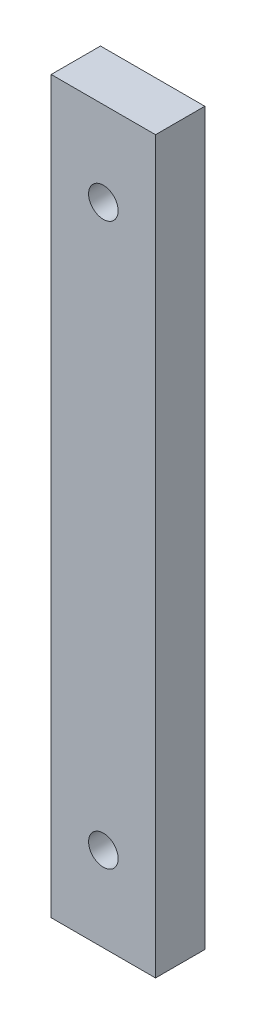
ISO-10303-21;
HEADER;
FILE_DESCRIPTION(('STEP AP214'),'2;1');
FILE_NAME('part.step','',(''),(''),'','','');
FILE_SCHEMA(('AUTOMOTIVE_DESIGN { 1 0 10303 214 1 1 1 1 }'));
ENDSEC;
DATA;
#1=APPLICATION_CONTEXT('core data for automotive mechanical design processes');
#2=APPLICATION_PROTOCOL_DEFINITION('international standard','automotive_design',2000,#1);
#3=PRODUCT_CONTEXT('',#1,'mechanical');
#4=PRODUCT('Part','Part','',(#3));
#5=PRODUCT_RELATED_PRODUCT_CATEGORY('part','',(#4));
#6=PRODUCT_DEFINITION_FORMATION('','',#4);
#7=PRODUCT_DEFINITION_CONTEXT('part definition',#1,'design');
#8=PRODUCT_DEFINITION('design','',#6,#7);
#9=PRODUCT_DEFINITION_SHAPE('','',#8);
#10=(LENGTH_UNIT() NAMED_UNIT(*) SI_UNIT(.MILLI.,.METRE.));
#11=(NAMED_UNIT(*) PLANE_ANGLE_UNIT() SI_UNIT($,.RADIAN.));
#12=(NAMED_UNIT(*) SI_UNIT($,.STERADIAN.) SOLID_ANGLE_UNIT());
#13=UNCERTAINTY_MEASURE_WITH_UNIT(LENGTH_MEASURE(1.E-05),#10,'distance_accuracy_value','');
#14=(GEOMETRIC_REPRESENTATION_CONTEXT(3) GLOBAL_UNCERTAINTY_ASSIGNED_CONTEXT((#13)) GLOBAL_UNIT_ASSIGNED_CONTEXT((#10,
#11,#12)) REPRESENTATION_CONTEXT('',''));
#15=CARTESIAN_POINT('',(0.,0.,0.));
#16=DIRECTION('',(0.,0.,1.));
#17=DIRECTION('',(1.,0.,0.));
#18=AXIS2_PLACEMENT_3D('',#15,#16,#17);
#19=CARTESIAN_POINT('',(0.,0.,6.));
#20=DIRECTION('',(0.,0.,1.));
#21=DIRECTION('',(1.,0.,0.));
#22=AXIS2_PLACEMENT_3D('',#19,#20,#21);
#23=PLANE('',#22);
#24=CARTESIAN_POINT('',(0.,34.15,6.));
#25=DIRECTION('',(0.,0.,1.));
#26=DIRECTION('',(1.,0.,0.));
#27=AXIS2_PLACEMENT_3D('',#24,#25,#26);
#28=CIRCLE('',#27,1.8);
#29=CARTESIAN_POINT('',(1.8,34.15,6.));
#30=VERTEX_POINT('',#29);
#31=EDGE_CURVE('E107',#30,#30,#28,.T.);
#32=ORIENTED_EDGE('',*,*,#31,.F.);
#33=EDGE_LOOP('',(#32));
#34=FACE_BOUND('',#33,.T.);
#35=DIRECTION('',(0.,-1.,0.));
#36=VECTOR('',#35,1.);
#37=CARTESIAN_POINT('',(-6.35,44.45,6.));
#38=LINE('',#37,#36);
#39=CARTESIAN_POINT('',(-6.35,44.45,6.));
#40=VERTEX_POINT('',#39);
#41=CARTESIAN_POINT('',(-6.35,-44.45,6.));
#42=VERTEX_POINT('',#41);
#43=EDGE_CURVE('E91',#40,#42,#38,.T.);
#44=ORIENTED_EDGE('',*,*,#43,.T.);
#45=DIRECTION('',(1.,0.,0.));
#46=VECTOR('',#45,1.);
#47=CARTESIAN_POINT('',(-6.35,-44.45,6.));
#48=LINE('',#47,#46);
#49=CARTESIAN_POINT('',(6.35,-44.45,6.));
#50=VERTEX_POINT('',#49);
#51=EDGE_CURVE('E86',#42,#50,#48,.T.);
#52=ORIENTED_EDGE('',*,*,#51,.T.);
#53=DIRECTION('',(0.,1.,0.));
#54=VECTOR('',#53,1.);
#55=CARTESIAN_POINT('',(6.35,-44.45,6.));
#56=LINE('',#55,#54);
#57=CARTESIAN_POINT('',(6.35,44.45,6.));
#58=VERTEX_POINT('',#57);
#59=EDGE_CURVE('E87',#50,#58,#56,.T.);
#60=ORIENTED_EDGE('',*,*,#59,.T.);
#61=DIRECTION('',(-1.,0.,0.));
#62=VECTOR('',#61,1.);
#63=CARTESIAN_POINT('',(6.35,44.45,6.));
#64=LINE('',#63,#62);
#65=EDGE_CURVE('E57',#58,#40,#64,.T.);
#66=ORIENTED_EDGE('',*,*,#65,.T.);
#67=EDGE_LOOP('',(#44,#52,#60,#66));
#68=FACE_BOUND('',#67,.T.);
#69=CARTESIAN_POINT('',(0.,-34.15,6.));
#70=DIRECTION('',(0.,0.,1.));
#71=DIRECTION('',(1.,0.,0.));
#72=AXIS2_PLACEMENT_3D('',#69,#70,#71);
#73=CIRCLE('',#72,1.8);
#74=CARTESIAN_POINT('',(1.8,-34.15,6.));
#75=VERTEX_POINT('',#74);
#76=EDGE_CURVE('E123',#75,#75,#73,.T.);
#77=ORIENTED_EDGE('',*,*,#76,.F.);
#78=EDGE_LOOP('',(#77));
#79=FACE_BOUND('',#78,.T.);
#80=ADVANCED_FACE('F39',(#34,#68,#79),#23,.T.);
#81=CARTESIAN_POINT('',(0.,0.,0.));
#82=DIRECTION('',(0.,0.,1.));
#83=DIRECTION('',(1.,0.,0.));
#84=AXIS2_PLACEMENT_3D('',#81,#82,#83);
#85=PLANE('',#84);
#86=DIRECTION('',(0.,-1.,0.));
#87=VECTOR('',#86,1.);
#88=CARTESIAN_POINT('',(-6.35,44.45,0.));
#89=LINE('',#88,#87);
#90=CARTESIAN_POINT('',(-6.35,44.45,0.));
#91=VERTEX_POINT('',#90);
#92=CARTESIAN_POINT('',(-6.35,-44.45,0.));
#93=VERTEX_POINT('',#92);
#94=EDGE_CURVE('E104',#91,#93,#89,.T.);
#95=ORIENTED_EDGE('',*,*,#94,.F.);
#96=DIRECTION('',(-1.,0.,0.));
#97=VECTOR('',#96,1.);
#98=CARTESIAN_POINT('',(6.35,44.45,0.));
#99=LINE('',#98,#97);
#100=CARTESIAN_POINT('',(6.35,44.45,0.));
#101=VERTEX_POINT('',#100);
#102=EDGE_CURVE('E80',#101,#91,#99,.T.);
#103=ORIENTED_EDGE('',*,*,#102,.F.);
#104=DIRECTION('',(0.,1.,0.));
#105=VECTOR('',#104,1.);
#106=CARTESIAN_POINT('',(6.35,-44.45,0.));
#107=LINE('',#106,#105);
#108=CARTESIAN_POINT('',(6.35,-44.45,0.));
#109=VERTEX_POINT('',#108);
#110=EDGE_CURVE('E75',#109,#101,#107,.T.);
#111=ORIENTED_EDGE('',*,*,#110,.F.);
#112=DIRECTION('',(1.,0.,0.));
#113=VECTOR('',#112,1.);
#114=CARTESIAN_POINT('',(-6.35,-44.45,0.));
#115=LINE('',#114,#113);
#116=EDGE_CURVE('E94',#93,#109,#115,.T.);
#117=ORIENTED_EDGE('',*,*,#116,.F.);
#118=EDGE_LOOP('',(#95,#103,#111,#117));
#119=FACE_BOUND('',#118,.T.);
#120=CARTESIAN_POINT('',(0.,34.15,0.));
#121=DIRECTION('',(0.,0.,1.));
#122=DIRECTION('',(1.,0.,0.));
#123=AXIS2_PLACEMENT_3D('',#120,#121,#122);
#124=CIRCLE('',#123,1.8);
#125=CARTESIAN_POINT('',(1.8,34.15,0.));
#126=VERTEX_POINT('',#125);
#127=EDGE_CURVE('E120',#126,#126,#124,.T.);
#128=ORIENTED_EDGE('',*,*,#127,.T.);
#129=EDGE_LOOP('',(#128));
#130=FACE_BOUND('',#129,.T.);
#131=CARTESIAN_POINT('',(0.,-34.15,0.));
#132=DIRECTION('',(0.,0.,1.));
#133=DIRECTION('',(1.,0.,0.));
#134=AXIS2_PLACEMENT_3D('',#131,#132,#133);
#135=CIRCLE('',#134,1.8);
#136=CARTESIAN_POINT('',(1.8,-34.15,0.));
#137=VERTEX_POINT('',#136);
#138=EDGE_CURVE('E125',#137,#137,#135,.T.);
#139=ORIENTED_EDGE('',*,*,#138,.T.);
#140=EDGE_LOOP('',(#139));
#141=FACE_BOUND('',#140,.T.);
#142=ADVANCED_FACE('F114',(#119,#130,#141),#85,.F.);
#143=CARTESIAN_POINT('',(-6.35,44.45,6.));
#144=DIRECTION('',(1.,0.,0.));
#145=DIRECTION('',(0.,0.,-1.));
#146=AXIS2_PLACEMENT_3D('',#143,#144,#145);
#147=PLANE('',#146);
#148=ORIENTED_EDGE('',*,*,#94,.T.);
#149=DIRECTION('',(0.,0.,-1.));
#150=VECTOR('',#149,1.);
#151=CARTESIAN_POINT('',(-6.35,-44.45,6.));
#152=LINE('',#151,#150);
#153=EDGE_CURVE('E11',#42,#93,#152,.T.);
#154=ORIENTED_EDGE('',*,*,#153,.F.);
#155=ORIENTED_EDGE('',*,*,#43,.F.);
#156=DIRECTION('',(0.,0.,-1.));
#157=VECTOR('',#156,1.);
#158=CARTESIAN_POINT('',(-6.35,44.45,6.));
#159=LINE('',#158,#157);
#160=EDGE_CURVE('E98',#40,#91,#159,.T.);
#161=ORIENTED_EDGE('',*,*,#160,.T.);
#162=EDGE_LOOP('',(#148,#154,#155,#161));
#163=FACE_BOUND('',#162,.T.);
#164=ADVANCED_FACE('F41',(#163),#147,.F.);
#165=CARTESIAN_POINT('',(-6.35,-44.45,6.));
#166=DIRECTION('',(0.,1.,0.));
#167=DIRECTION('',(0.,0.,1.));
#168=AXIS2_PLACEMENT_3D('',#165,#166,#167);
#169=PLANE('',#168);
#170=ORIENTED_EDGE('',*,*,#116,.T.);
#171=DIRECTION('',(0.,0.,-1.));
#172=VECTOR('',#171,1.);
#173=CARTESIAN_POINT('',(6.35,-44.45,6.));
#174=LINE('',#173,#172);
#175=EDGE_CURVE('E48',#50,#109,#174,.T.);
#176=ORIENTED_EDGE('',*,*,#175,.F.);
#177=ORIENTED_EDGE('',*,*,#51,.F.);
#178=ORIENTED_EDGE('',*,*,#153,.T.);
#179=EDGE_LOOP('',(#170,#176,#177,#178));
#180=FACE_BOUND('',#179,.T.);
#181=ADVANCED_FACE('F92',(#180),#169,.F.);
#182=CARTESIAN_POINT('',(6.35,-44.45,6.));
#183=DIRECTION('',(-1.,0.,0.));
#184=DIRECTION('',(0.,0.,1.));
#185=AXIS2_PLACEMENT_3D('',#182,#183,#184);
#186=PLANE('',#185);
#187=ORIENTED_EDGE('',*,*,#110,.T.);
#188=DIRECTION('',(0.,0.,-1.));
#189=VECTOR('',#188,1.);
#190=CARTESIAN_POINT('',(6.35,44.45,6.));
#191=LINE('',#190,#189);
#192=EDGE_CURVE('E96',#58,#101,#191,.T.);
#193=ORIENTED_EDGE('',*,*,#192,.F.);
#194=ORIENTED_EDGE('',*,*,#59,.F.);
#195=ORIENTED_EDGE('',*,*,#175,.T.);
#196=EDGE_LOOP('',(#187,#193,#194,#195));
#197=FACE_BOUND('',#196,.T.);
#198=ADVANCED_FACE('F100',(#197),#186,.F.);
#199=CARTESIAN_POINT('',(6.35,44.45,6.));
#200=DIRECTION('',(0.,-1.,0.));
#201=DIRECTION('',(0.,0.,-1.));
#202=AXIS2_PLACEMENT_3D('',#199,#200,#201);
#203=PLANE('',#202);
#204=ORIENTED_EDGE('',*,*,#102,.T.);
#205=ORIENTED_EDGE('',*,*,#160,.F.);
#206=ORIENTED_EDGE('',*,*,#65,.F.);
#207=ORIENTED_EDGE('',*,*,#192,.T.);
#208=EDGE_LOOP('',(#204,#205,#206,#207));
#209=FACE_BOUND('',#208,.T.);
#210=ADVANCED_FACE('F112',(#209),#203,.F.);
#211=CARTESIAN_POINT('',(0.,34.15,6.));
#212=DIRECTION('',(0.,0.,-1.));
#213=DIRECTION('',(-1.,0.,0.));
#214=AXIS2_PLACEMENT_3D('',#211,#212,#213);
#215=CYLINDRICAL_SURFACE('',#214,1.8);
#216=ORIENTED_EDGE('',*,*,#31,.T.);
#217=EDGE_LOOP('',(#216));
#218=FACE_BOUND('',#217,.T.);
#219=ORIENTED_EDGE('',*,*,#127,.F.);
#220=EDGE_LOOP('',(#219));
#221=FACE_BOUND('',#220,.T.);
#222=ADVANCED_FACE('F141',(#218,#221),#215,.F.);
#223=CARTESIAN_POINT('',(0.,-34.15,6.));
#224=DIRECTION('',(0.,0.,-1.));
#225=DIRECTION('',(-1.,0.,0.));
#226=AXIS2_PLACEMENT_3D('',#223,#224,#225);
#227=CYLINDRICAL_SURFACE('',#226,1.8);
#228=ORIENTED_EDGE('',*,*,#76,.T.);
#229=EDGE_LOOP('',(#228));
#230=FACE_BOUND('',#229,.T.);
#231=ORIENTED_EDGE('',*,*,#138,.F.);
#232=EDGE_LOOP('',(#231));
#233=FACE_BOUND('',#232,.T.);
#234=ADVANCED_FACE('F127',(#230,#233),#227,.F.);
#235=CLOSED_SHELL('',(#80,#142,#164,#181,#198,#210,#222,#234));
#236=MANIFOLD_SOLID_BREP('B2',#235);
#237=ADVANCED_BREP_SHAPE_REPRESENTATION('',(#18,#236),#14);
#238=SHAPE_DEFINITION_REPRESENTATION(#9,#237);
ENDSEC;
END-ISO-10303-21;
